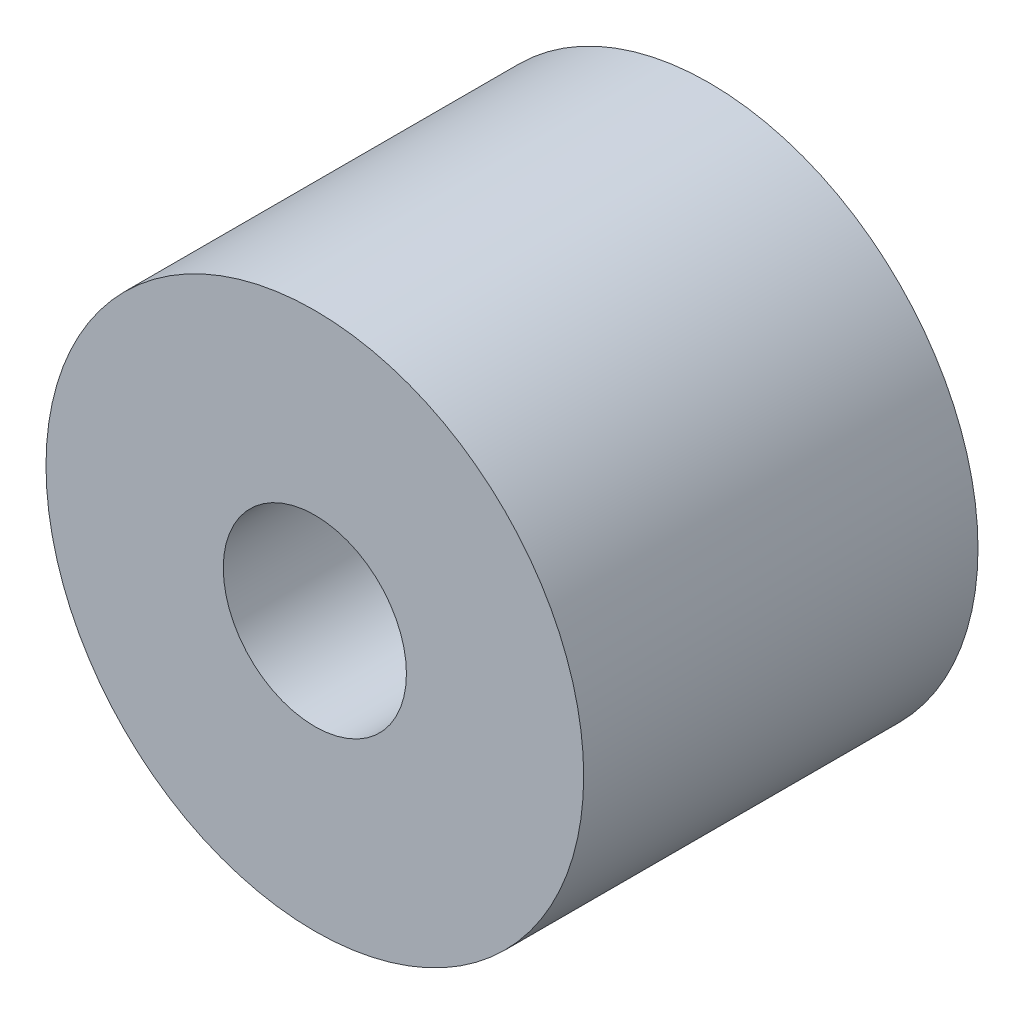
ISO-10303-21;
HEADER;
FILE_DESCRIPTION(('STEP AP214'),'2;1');
FILE_NAME('part.step','',(''),(''),'','','');
FILE_SCHEMA(('AUTOMOTIVE_DESIGN { 1 0 10303 214 1 1 1 1 }'));
ENDSEC;
DATA;
#1=APPLICATION_CONTEXT('core data for automotive mechanical design processes');
#2=APPLICATION_PROTOCOL_DEFINITION('international standard','automotive_design',2000,#1);
#3=PRODUCT_CONTEXT('',#1,'mechanical');
#4=PRODUCT('Part','Part','',(#3));
#5=PRODUCT_RELATED_PRODUCT_CATEGORY('part','',(#4));
#6=PRODUCT_DEFINITION_FORMATION('','',#4);
#7=PRODUCT_DEFINITION_CONTEXT('part definition',#1,'design');
#8=PRODUCT_DEFINITION('design','',#6,#7);
#9=PRODUCT_DEFINITION_SHAPE('','',#8);
#10=(LENGTH_UNIT() NAMED_UNIT(*) SI_UNIT(.MILLI.,.METRE.));
#11=(NAMED_UNIT(*) PLANE_ANGLE_UNIT() SI_UNIT($,.RADIAN.));
#12=(NAMED_UNIT(*) SI_UNIT($,.STERADIAN.) SOLID_ANGLE_UNIT());
#13=UNCERTAINTY_MEASURE_WITH_UNIT(LENGTH_MEASURE(1.E-05),#10,'distance_accuracy_value','');
#14=(GEOMETRIC_REPRESENTATION_CONTEXT(3) GLOBAL_UNCERTAINTY_ASSIGNED_CONTEXT((#13)) GLOBAL_UNIT_ASSIGNED_CONTEXT((#10,
#11,#12)) REPRESENTATION_CONTEXT('',''));
#15=CARTESIAN_POINT('',(0.,0.,0.));
#16=DIRECTION('',(0.,0.,1.));
#17=DIRECTION('',(1.,0.,0.));
#18=AXIS2_PLACEMENT_3D('',#15,#16,#17);
#19=CARTESIAN_POINT('',(0.,0.,11.));
#20=DIRECTION('',(0.,0.,1.));
#21=DIRECTION('',(1.,0.,0.));
#22=AXIS2_PLACEMENT_3D('',#19,#20,#21);
#23=PLANE('',#22);
#24=CARTESIAN_POINT('',(0.,0.,11.));
#25=DIRECTION('',(0.,0.,1.));
#26=DIRECTION('',(1.,0.,0.));
#27=AXIS2_PLACEMENT_3D('',#24,#25,#26);
#28=CIRCLE('',#27,7.5);
#29=CARTESIAN_POINT('',(7.5,0.,11.));
#30=VERTEX_POINT('',#29);
#31=EDGE_CURVE('E10',#30,#30,#28,.T.);
#32=ORIENTED_EDGE('',*,*,#31,.T.);
#33=EDGE_LOOP('',(#32));
#34=FACE_BOUND('',#33,.T.);
#35=CARTESIAN_POINT('',(0.,0.,11.));
#36=DIRECTION('',(0.,0.,1.));
#37=DIRECTION('',(1.,0.,0.));
#38=AXIS2_PLACEMENT_3D('',#35,#36,#37);
#39=CIRCLE('',#38,2.555);
#40=CARTESIAN_POINT('',(2.555,0.,11.));
#41=VERTEX_POINT('',#40);
#42=EDGE_CURVE('E52',#41,#41,#39,.T.);
#43=ORIENTED_EDGE('',*,*,#42,.F.);
#44=EDGE_LOOP('',(#43));
#45=FACE_BOUND('',#44,.T.);
#46=ADVANCED_FACE('F39',(#34,#45),#23,.T.);
#47=CARTESIAN_POINT('',(0.,0.,0.));
#48=DIRECTION('',(0.,0.,1.));
#49=DIRECTION('',(1.,0.,0.));
#50=AXIS2_PLACEMENT_3D('',#47,#48,#49);
#51=PLANE('',#50);
#52=CARTESIAN_POINT('',(0.,0.,0.));
#53=DIRECTION('',(0.,0.,1.));
#54=DIRECTION('',(1.,0.,0.));
#55=AXIS2_PLACEMENT_3D('',#52,#53,#54);
#56=CIRCLE('',#55,7.5);
#57=CARTESIAN_POINT('',(7.5,0.,0.));
#58=VERTEX_POINT('',#57);
#59=EDGE_CURVE('E43',#58,#58,#56,.T.);
#60=ORIENTED_EDGE('',*,*,#59,.F.);
#61=EDGE_LOOP('',(#60));
#62=FACE_BOUND('',#61,.T.);
#63=CARTESIAN_POINT('',(0.,0.,0.));
#64=DIRECTION('',(0.,0.,1.));
#65=DIRECTION('',(1.,0.,0.));
#66=AXIS2_PLACEMENT_3D('',#63,#64,#65);
#67=CIRCLE('',#66,2.555);
#68=CARTESIAN_POINT('',(2.555,0.,0.));
#69=VERTEX_POINT('',#68);
#70=EDGE_CURVE('E54',#69,#69,#67,.T.);
#71=ORIENTED_EDGE('',*,*,#70,.T.);
#72=EDGE_LOOP('',(#71));
#73=FACE_BOUND('',#72,.T.);
#74=ADVANCED_FACE('F66',(#62,#73),#51,.F.);
#75=CARTESIAN_POINT('',(0.,0.,11.));
#76=DIRECTION('',(0.,0.,-1.));
#77=DIRECTION('',(-1.,0.,0.));
#78=AXIS2_PLACEMENT_3D('',#75,#76,#77);
#79=CYLINDRICAL_SURFACE('',#78,7.5);
#80=ORIENTED_EDGE('',*,*,#31,.F.);
#81=EDGE_LOOP('',(#80));
#82=FACE_BOUND('',#81,.T.);
#83=ORIENTED_EDGE('',*,*,#59,.T.);
#84=EDGE_LOOP('',(#83));
#85=FACE_BOUND('',#84,.T.);
#86=ADVANCED_FACE('F41',(#82,#85),#79,.T.);
#87=CARTESIAN_POINT('',(0.,0.,11.));
#88=DIRECTION('',(0.,0.,-1.));
#89=DIRECTION('',(-1.,0.,0.));
#90=AXIS2_PLACEMENT_3D('',#87,#88,#89);
#91=CYLINDRICAL_SURFACE('',#90,2.555);
#92=ORIENTED_EDGE('',*,*,#42,.T.);
#93=EDGE_LOOP('',(#92));
#94=FACE_BOUND('',#93,.T.);
#95=ORIENTED_EDGE('',*,*,#70,.F.);
#96=EDGE_LOOP('',(#95));
#97=FACE_BOUND('',#96,.T.);
#98=ADVANCED_FACE('F62',(#94,#97),#91,.F.);
#99=CLOSED_SHELL('',(#46,#74,#86,#98));
#100=MANIFOLD_SOLID_BREP('B2',#99);
#101=ADVANCED_BREP_SHAPE_REPRESENTATION('',(#18,#100),#14);
#102=SHAPE_DEFINITION_REPRESENTATION(#9,#101);
ENDSEC;
END-ISO-10303-21;
